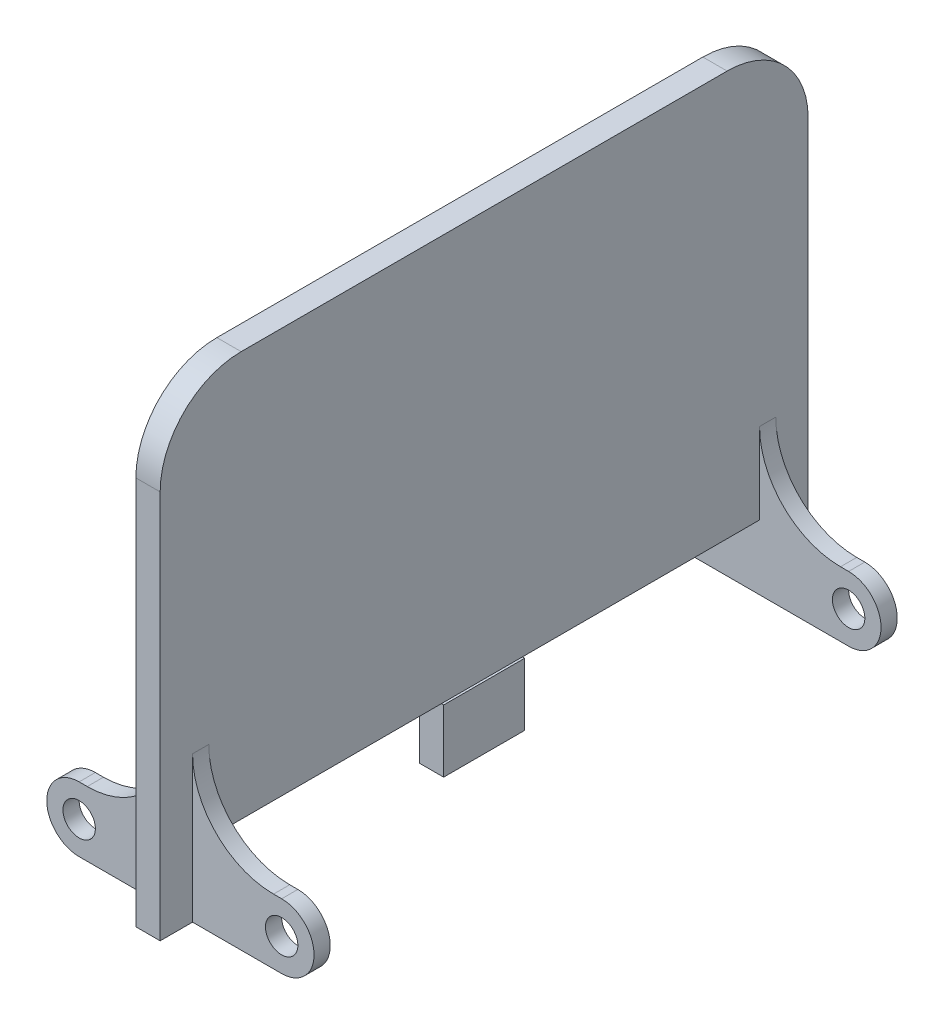
ISO-10303-21;
HEADER;
FILE_DESCRIPTION(('STEP AP214'),'2;1');
FILE_NAME('part.step','',(''),(''),'','','');
FILE_SCHEMA(('AUTOMOTIVE_DESIGN { 1 0 10303 214 1 1 1 1 }'));
ENDSEC;
DATA;
#1=APPLICATION_CONTEXT('core data for automotive mechanical design processes');
#2=APPLICATION_PROTOCOL_DEFINITION('international standard','automotive_design',2000,#1);
#3=PRODUCT_CONTEXT('',#1,'mechanical');
#4=PRODUCT('Part','Part','',(#3));
#5=PRODUCT_RELATED_PRODUCT_CATEGORY('part','',(#4));
#6=PRODUCT_DEFINITION_FORMATION('','',#4);
#7=PRODUCT_DEFINITION_CONTEXT('part definition',#1,'design');
#8=PRODUCT_DEFINITION('design','',#6,#7);
#9=PRODUCT_DEFINITION_SHAPE('','',#8);
#10=(LENGTH_UNIT() NAMED_UNIT(*) SI_UNIT(.MILLI.,.METRE.));
#11=(NAMED_UNIT(*) PLANE_ANGLE_UNIT() SI_UNIT($,.RADIAN.));
#12=(NAMED_UNIT(*) SI_UNIT($,.STERADIAN.) SOLID_ANGLE_UNIT());
#13=UNCERTAINTY_MEASURE_WITH_UNIT(LENGTH_MEASURE(1.E-05),#10,'distance_accuracy_value','');
#14=(GEOMETRIC_REPRESENTATION_CONTEXT(3) GLOBAL_UNCERTAINTY_ASSIGNED_CONTEXT((#13)) GLOBAL_UNIT_ASSIGNED_CONTEXT((#10,
#11,#12)) REPRESENTATION_CONTEXT('',''));
#15=CARTESIAN_POINT('',(0.,0.,0.));
#16=DIRECTION('',(0.,0.,1.));
#17=DIRECTION('',(1.,0.,0.));
#18=AXIS2_PLACEMENT_3D('',#15,#16,#17);
#19=CARTESIAN_POINT('',(-1.63322603296561,3.72,41.));
#20=DIRECTION('',(0.,0.,1.));
#21=DIRECTION('',(1.,0.,0.));
#22=AXIS2_PLACEMENT_3D('',#19,#20,#21);
#23=PLANE('',#22);
#24=DIRECTION('',(0.,1.,0.));
#25=VECTOR('',#24,1.);
#26=CARTESIAN_POINT('',(11.,3.72,41.));
#27=LINE('',#26,#25);
#28=CARTESIAN_POINT('',(11.,-4.,41.));
#29=VERTEX_POINT('',#28);
#30=CARTESIAN_POINT('',(11.,3.72,41.));
#31=VERTEX_POINT('',#30);
#32=EDGE_CURVE('E57',#29,#31,#27,.T.);
#33=ORIENTED_EDGE('',*,*,#32,.F.);
#34=DIRECTION('',(1.,0.,0.));
#35=VECTOR('',#34,1.);
#36=CARTESIAN_POINT('',(-1.63322603296561,-4.,41.));
#37=LINE('',#36,#35);
#38=CARTESIAN_POINT('',(14.,-4.,41.));
#39=VERTEX_POINT('',#38);
#40=EDGE_CURVE('E85',#29,#39,#37,.T.);
#41=ORIENTED_EDGE('',*,*,#40,.T.);
#42=DIRECTION('',(0.,-1.,0.));
#43=VECTOR('',#42,1.);
#44=CARTESIAN_POINT('',(14.,3.72,41.));
#45=LINE('',#44,#43);
#46=CARTESIAN_POINT('',(14.,3.72,41.));
#47=VERTEX_POINT('',#46);
#48=EDGE_CURVE('E89',#47,#39,#45,.T.);
#49=ORIENTED_EDGE('',*,*,#48,.F.);
#50=DIRECTION('',(1.,0.,0.));
#51=VECTOR('',#50,1.);
#52=CARTESIAN_POINT('',(-1.63322603296561,3.72,41.));
#53=LINE('',#52,#51);
#54=EDGE_CURVE('E112',#31,#47,#53,.T.);
#55=ORIENTED_EDGE('',*,*,#54,.F.);
#56=EDGE_LOOP('',(#33,#41,#49,#55));
#57=FACE_BOUND('',#56,.T.);
#58=ADVANCED_FACE('F49',(#57),#23,.T.);
#59=CARTESIAN_POINT('',(-1.63322603296561,3.72,41.));
#60=DIRECTION('',(0.,1.,0.));
#61=DIRECTION('',(-1.,0.,0.));
#62=AXIS2_PLACEMENT_3D('',#59,#60,#61);
#63=PLANE('',#62);
#64=DIRECTION('',(0.,0.,-1.));
#65=VECTOR('',#64,1.);
#66=CARTESIAN_POINT('',(11.,3.72,41.));
#67=LINE('',#66,#65);
#68=CARTESIAN_POINT('',(11.,3.72,31.));
#69=VERTEX_POINT('',#68);
#70=EDGE_CURVE('E63',#31,#69,#67,.T.);
#71=ORIENTED_EDGE('',*,*,#70,.F.);
#72=ORIENTED_EDGE('',*,*,#54,.T.);
#73=DIRECTION('',(0.,0.,1.));
#74=VECTOR('',#73,1.);
#75=CARTESIAN_POINT('',(14.,3.72,41.));
#76=LINE('',#75,#74);
#77=CARTESIAN_POINT('',(14.,3.72,31.));
#78=VERTEX_POINT('',#77);
#79=EDGE_CURVE('E94',#78,#47,#76,.T.);
#80=ORIENTED_EDGE('',*,*,#79,.F.);
#81=DIRECTION('',(1.,0.,0.));
#82=VECTOR('',#81,1.);
#83=CARTESIAN_POINT('',(-1.63322603296561,3.72,31.));
#84=LINE('',#83,#82);
#85=EDGE_CURVE('E115',#69,#78,#84,.T.);
#86=ORIENTED_EDGE('',*,*,#85,.F.);
#87=EDGE_LOOP('',(#71,#72,#80,#86));
#88=FACE_BOUND('',#87,.T.);
#89=ADVANCED_FACE('F121',(#88),#63,.T.);
#90=CARTESIAN_POINT('',(-1.63322603296561,3.72,31.));
#91=DIRECTION('',(0.,0.,-1.));
#92=DIRECTION('',(-1.,0.,0.));
#93=AXIS2_PLACEMENT_3D('',#90,#91,#92);
#94=PLANE('',#93);
#95=DIRECTION('',(0.,-1.,0.));
#96=VECTOR('',#95,1.);
#97=CARTESIAN_POINT('',(11.,3.72,31.));
#98=LINE('',#97,#96);
#99=CARTESIAN_POINT('',(11.,-4.,31.));
#100=VERTEX_POINT('',#99);
#101=EDGE_CURVE('E114',#69,#100,#98,.T.);
#102=ORIENTED_EDGE('',*,*,#101,.F.);
#103=ORIENTED_EDGE('',*,*,#85,.T.);
#104=DIRECTION('',(0.,1.,0.));
#105=VECTOR('',#104,1.);
#106=CARTESIAN_POINT('',(14.,3.72,31.));
#107=LINE('',#106,#105);
#108=CARTESIAN_POINT('',(14.,-4.,31.));
#109=VERTEX_POINT('',#108);
#110=EDGE_CURVE('E102',#109,#78,#107,.T.);
#111=ORIENTED_EDGE('',*,*,#110,.F.);
#112=DIRECTION('',(1.,0.,0.));
#113=VECTOR('',#112,1.);
#114=CARTESIAN_POINT('',(-1.63322603296561,-4.,31.));
#115=LINE('',#114,#113);
#116=EDGE_CURVE('E93',#100,#109,#115,.T.);
#117=ORIENTED_EDGE('',*,*,#116,.F.);
#118=EDGE_LOOP('',(#102,#103,#111,#117));
#119=FACE_BOUND('',#118,.T.);
#120=ADVANCED_FACE('F119',(#119),#94,.T.);
#121=CARTESIAN_POINT('',(-1.63322603296561,-4.,41.));
#122=DIRECTION('',(0.,-1.,0.));
#123=DIRECTION('',(1.,0.,0.));
#124=AXIS2_PLACEMENT_3D('',#121,#122,#123);
#125=PLANE('',#124);
#126=DIRECTION('',(0.,0.,1.));
#127=VECTOR('',#126,1.);
#128=CARTESIAN_POINT('',(11.,-4.,41.));
#129=LINE('',#128,#127);
#130=EDGE_CURVE('E12',#100,#29,#129,.T.);
#131=ORIENTED_EDGE('',*,*,#130,.F.);
#132=ORIENTED_EDGE('',*,*,#116,.T.);
#133=DIRECTION('',(0.,0.,-1.));
#134=VECTOR('',#133,1.);
#135=CARTESIAN_POINT('',(14.,-4.,41.));
#136=LINE('',#135,#134);
#137=EDGE_CURVE('E96',#39,#109,#136,.T.);
#138=ORIENTED_EDGE('',*,*,#137,.F.);
#139=ORIENTED_EDGE('',*,*,#40,.F.);
#140=EDGE_LOOP('',(#131,#132,#138,#139));
#141=FACE_BOUND('',#140,.T.);
#142=ADVANCED_FACE('F97',(#141),#125,.T.);
#143=CARTESIAN_POINT('',(14.,0.,0.));
#144=DIRECTION('',(1.,0.,0.));
#145=DIRECTION('',(0.,0.,-1.));
#146=AXIS2_PLACEMENT_3D('',#143,#144,#145);
#147=PLANE('',#146);
#148=ORIENTED_EDGE('',*,*,#48,.T.);
#149=ORIENTED_EDGE('',*,*,#137,.T.);
#150=ORIENTED_EDGE('',*,*,#110,.T.);
#151=ORIENTED_EDGE('',*,*,#79,.T.);
#152=EDGE_LOOP('',(#148,#149,#150,#151));
#153=FACE_BOUND('',#152,.T.);
#154=ADVANCED_FACE('F104',(#153),#147,.T.);
#155=CARTESIAN_POINT('',(11.,54.,-4.));
#156=DIRECTION('',(1.,0.,0.));
#157=DIRECTION('',(0.,1.,0.));
#158=AXIS2_PLACEMENT_3D('',#155,#156,#157);
#159=PLANE('',#158);
#160=ORIENTED_EDGE('',*,*,#32,.T.);
#161=ORIENTED_EDGE('',*,*,#70,.T.);
#162=ORIENTED_EDGE('',*,*,#101,.T.);
#163=ORIENTED_EDGE('',*,*,#130,.T.);
#164=EDGE_LOOP('',(#160,#161,#162,#163));
#165=FACE_BOUND('',#164,.T.);
#166=ADVANCED_FACE('F123',(#165),#159,.F.);
#167=CLOSED_SHELL('',(#58,#89,#120,#142,#154,#166));
#168=MANIFOLD_SOLID_BREP('B2',#167);
#169=CARTESIAN_POINT('',(0.,0.,72.));
#170=DIRECTION('',(0.,0.,-1.));
#171=DIRECTION('',(1.,0.,0.));
#172=AXIS2_PLACEMENT_3D('',#169,#170,#171);
#173=PLANE('',#172);
#174=CARTESIAN_POINT('',(0.,0.,72.));
#175=DIRECTION('',(0.,0.,1.));
#176=DIRECTION('',(1.,0.,0.));
#177=AXIS2_PLACEMENT_3D('',#174,#175,#176);
#178=CIRCLE('',#177,2.);
#179=CARTESIAN_POINT('',(2.,0.,72.));
#180=VERTEX_POINT('',#179);
#181=EDGE_CURVE('E381',#180,#180,#178,.T.);
#182=ORIENTED_EDGE('',*,*,#181,.F.);
#183=EDGE_LOOP('',(#182));
#184=FACE_BOUND('',#183,.T.);
#185=DIRECTION('',(1.,0.,0.));
#186=VECTOR('',#185,1.);
#187=CARTESIAN_POINT('',(0.,-4.,72.));
#188=LINE('',#187,#186);
#189=CARTESIAN_POINT('',(0.,-4.,72.));
#190=VERTEX_POINT('',#189);
#191=CARTESIAN_POINT('',(11.,-4.,72.));
#192=VERTEX_POINT('',#191);
#193=EDGE_CURVE('E393',#190,#192,#188,.T.);
#194=ORIENTED_EDGE('',*,*,#193,.T.);
#195=DIRECTION('',(0.,1.,0.));
#196=VECTOR('',#195,1.);
#197=CARTESIAN_POINT('',(11.,-9.00000000000001,72.));
#198=LINE('',#197,#196);
#199=CARTESIAN_POINT('',(11.,14.,72.));
#200=VERTEX_POINT('',#199);
#201=EDGE_CURVE('E367',#192,#200,#198,.T.);
#202=ORIENTED_EDGE('',*,*,#201,.T.);
#203=CARTESIAN_POINT('',(0.999999999999994,14.,72.));
#204=DIRECTION('',(0.,0.,-1.));
#205=DIRECTION('',(-1.,0.,0.));
#206=AXIS2_PLACEMENT_3D('',#203,#204,#205);
#207=CIRCLE('',#206,10.);
#208=CARTESIAN_POINT('',(0.999999999999994,4.,72.));
#209=VERTEX_POINT('',#208);
#210=EDGE_CURVE('E540',#200,#209,#207,.T.);
#211=ORIENTED_EDGE('',*,*,#210,.T.);
#212=DIRECTION('',(-1.,0.,0.));
#213=VECTOR('',#212,1.);
#214=CARTESIAN_POINT('',(0.,4.,72.));
#215=LINE('',#214,#213);
#216=CARTESIAN_POINT('',(0.,4.,72.));
#217=VERTEX_POINT('',#216);
#218=EDGE_CURVE('E406',#209,#217,#215,.T.);
#219=ORIENTED_EDGE('',*,*,#218,.T.);
#220=CARTESIAN_POINT('',(0.,0.,72.));
#221=DIRECTION('',(0.,0.,1.));
#222=DIRECTION('',(1.,0.,0.));
#223=AXIS2_PLACEMENT_3D('',#220,#221,#222);
#224=CIRCLE('',#223,4.);
#225=EDGE_CURVE('E386',#217,#190,#224,.T.);
#226=ORIENTED_EDGE('',*,*,#225,.T.);
#227=EDGE_LOOP('',(#194,#202,#211,#219,#226));
#228=FACE_BOUND('',#227,.T.);
#229=ADVANCED_FACE('F173',(#184,#228),#173,.F.);
#230=CARTESIAN_POINT('',(0.,0.,0.));
#231=DIRECTION('',(0.,0.,1.));
#232=DIRECTION('',(1.,0.,0.));
#233=AXIS2_PLACEMENT_3D('',#230,#231,#232);
#234=PLANE('',#233);
#235=CARTESIAN_POINT('',(25.,0.,0.));
#236=DIRECTION('',(0.,0.,1.));
#237=DIRECTION('',(1.,0.,0.));
#238=AXIS2_PLACEMENT_3D('',#235,#236,#237);
#239=CIRCLE('',#238,2.);
#240=CARTESIAN_POINT('',(27.,0.,0.));
#241=VERTEX_POINT('',#240);
#242=EDGE_CURVE('E449',#241,#241,#239,.T.);
#243=ORIENTED_EDGE('',*,*,#242,.T.);
#244=EDGE_LOOP('',(#243));
#245=FACE_BOUND('',#244,.T.);
#246=DIRECTION('',(0.,1.,0.));
#247=VECTOR('',#246,1.);
#248=CARTESIAN_POINT('',(14.,-9.,0.));
#249=LINE('',#248,#247);
#250=CARTESIAN_POINT('',(14.,-4.,0.));
#251=VERTEX_POINT('',#250);
#252=CARTESIAN_POINT('',(14.,14.,0.));
#253=VERTEX_POINT('',#252);
#254=EDGE_CURVE('E427',#251,#253,#249,.T.);
#255=ORIENTED_EDGE('',*,*,#254,.T.);
#256=CARTESIAN_POINT('',(24.,14.,0.));
#257=DIRECTION('',(0.,0.,1.));
#258=DIRECTION('',(1.,0.,0.));
#259=AXIS2_PLACEMENT_3D('',#256,#257,#258);
#260=CIRCLE('',#259,10.);
#261=CARTESIAN_POINT('',(24.,4.,0.));
#262=VERTEX_POINT('',#261);
#263=EDGE_CURVE('E518',#253,#262,#260,.T.);
#264=ORIENTED_EDGE('',*,*,#263,.T.);
#265=DIRECTION('',(-1.,0.,0.));
#266=VECTOR('',#265,1.);
#267=CARTESIAN_POINT('',(0.,4.,0.));
#268=LINE('',#267,#266);
#269=CARTESIAN_POINT('',(25.,4.,0.));
#270=VERTEX_POINT('',#269);
#271=EDGE_CURVE('E466',#270,#262,#268,.T.);
#272=ORIENTED_EDGE('',*,*,#271,.F.);
#273=CARTESIAN_POINT('',(25.,0.,0.));
#274=DIRECTION('',(0.,0.,1.));
#275=DIRECTION('',(1.,0.,0.));
#276=AXIS2_PLACEMENT_3D('',#273,#274,#275);
#277=CIRCLE('',#276,4.);
#278=CARTESIAN_POINT('',(25.,-4.,0.));
#279=VERTEX_POINT('',#278);
#280=EDGE_CURVE('E482',#279,#270,#277,.T.);
#281=ORIENTED_EDGE('',*,*,#280,.F.);
#282=DIRECTION('',(1.,0.,0.));
#283=VECTOR('',#282,1.);
#284=CARTESIAN_POINT('',(0.,-4.,0.));
#285=LINE('',#284,#283);
#286=EDGE_CURVE('E478',#251,#279,#285,.T.);
#287=ORIENTED_EDGE('',*,*,#286,.F.);
#288=EDGE_LOOP('',(#255,#264,#272,#281,#287));
#289=FACE_BOUND('',#288,.T.);
#290=ADVANCED_FACE('F580',(#245,#289),#234,.F.);
#291=CARTESIAN_POINT('',(0.,0.,0.));
#292=DIRECTION('',(0.,0.,1.));
#293=DIRECTION('',(1.,0.,0.));
#294=AXIS2_PLACEMENT_3D('',#291,#292,#293);
#295=CIRCLE('',#294,2.);
#296=CARTESIAN_POINT('',(2.,0.,0.));
#297=VERTEX_POINT('',#296);
#298=EDGE_CURVE('E453',#297,#297,#295,.T.);
#299=ORIENTED_EDGE('',*,*,#298,.T.);
#300=EDGE_LOOP('',(#299));
#301=FACE_BOUND('',#300,.T.);
#302=DIRECTION('',(0.,1.,0.));
#303=VECTOR('',#302,1.);
#304=CARTESIAN_POINT('',(11.,-9.,0.));
#305=LINE('',#304,#303);
#306=CARTESIAN_POINT('',(11.,-4.,0.));
#307=VERTEX_POINT('',#306);
#308=CARTESIAN_POINT('',(11.,14.,0.));
#309=VERTEX_POINT('',#308);
#310=EDGE_CURVE('E422',#307,#309,#305,.T.);
#311=ORIENTED_EDGE('',*,*,#310,.F.);
#312=CARTESIAN_POINT('',(0.,-4.,0.));
#313=VERTEX_POINT('',#312);
#314=EDGE_CURVE('E479',#313,#307,#285,.T.);
#315=ORIENTED_EDGE('',*,*,#314,.F.);
#316=CARTESIAN_POINT('',(0.,0.,0.));
#317=DIRECTION('',(0.,0.,1.));
#318=DIRECTION('',(1.,0.,0.));
#319=AXIS2_PLACEMENT_3D('',#316,#317,#318);
#320=CIRCLE('',#319,4.);
#321=CARTESIAN_POINT('',(0.,4.,0.));
#322=VERTEX_POINT('',#321);
#323=EDGE_CURVE('E459',#322,#313,#320,.T.);
#324=ORIENTED_EDGE('',*,*,#323,.F.);
#325=CARTESIAN_POINT('',(1.,4.,0.));
#326=VERTEX_POINT('',#325);
#327=EDGE_CURVE('E484',#326,#322,#268,.T.);
#328=ORIENTED_EDGE('',*,*,#327,.F.);
#329=CARTESIAN_POINT('',(1.,14.,0.));
#330=DIRECTION('',(0.,0.,1.));
#331=DIRECTION('',(1.,0.,0.));
#332=AXIS2_PLACEMENT_3D('',#329,#330,#331);
#333=CIRCLE('',#332,10.);
#334=EDGE_CURVE('E515',#326,#309,#333,.T.);
#335=ORIENTED_EDGE('',*,*,#334,.T.);
#336=EDGE_LOOP('',(#311,#315,#324,#328,#335));
#337=FACE_BOUND('',#336,.T.);
#338=ADVANCED_FACE('F601',(#301,#337),#234,.F.);
#339=CARTESIAN_POINT('',(0.,4.,2.));
#340=DIRECTION('',(0.,-1.,0.));
#341=DIRECTION('',(0.,0.,-1.));
#342=AXIS2_PLACEMENT_3D('',#339,#340,#341);
#343=PLANE('',#342);
#344=DIRECTION('',(-1.,0.,0.));
#345=VECTOR('',#344,1.);
#346=CARTESIAN_POINT('',(0.,4.,2.));
#347=LINE('',#346,#345);
#348=CARTESIAN_POINT('',(1.,4.,2.));
#349=VERTEX_POINT('',#348);
#350=CARTESIAN_POINT('',(0.,4.,2.));
#351=VERTEX_POINT('',#350);
#352=EDGE_CURVE('E470',#349,#351,#347,.T.);
#353=ORIENTED_EDGE('',*,*,#352,.F.);
#354=DIRECTION('',(0.,0.,1.));
#355=VECTOR('',#354,1.);
#356=CARTESIAN_POINT('',(1.,4.,0.));
#357=LINE('',#356,#355);
#358=EDGE_CURVE('E503',#349,#326,#357,.F.);
#359=ORIENTED_EDGE('',*,*,#358,.T.);
#360=ORIENTED_EDGE('',*,*,#327,.T.);
#361=DIRECTION('',(0.,0.,-1.));
#362=VECTOR('',#361,1.);
#363=CARTESIAN_POINT('',(0.,4.,2.));
#364=LINE('',#363,#362);
#365=EDGE_CURVE('E474',#351,#322,#364,.T.);
#366=ORIENTED_EDGE('',*,*,#365,.F.);
#367=EDGE_LOOP('',(#353,#359,#360,#366));
#368=FACE_BOUND('',#367,.T.);
#369=ADVANCED_FACE('F653',(#368),#343,.F.);
#370=ORIENTED_EDGE('',*,*,#271,.T.);
#371=DIRECTION('',(0.,0.,-1.));
#372=VECTOR('',#371,1.);
#373=CARTESIAN_POINT('',(24.,4.,2.));
#374=LINE('',#373,#372);
#375=CARTESIAN_POINT('',(24.,4.,2.));
#376=VERTEX_POINT('',#375);
#377=EDGE_CURVE('E511',#262,#376,#374,.F.);
#378=ORIENTED_EDGE('',*,*,#377,.T.);
#379=CARTESIAN_POINT('',(25.,4.,2.));
#380=VERTEX_POINT('',#379);
#381=EDGE_CURVE('E471',#380,#376,#347,.T.);
#382=ORIENTED_EDGE('',*,*,#381,.F.);
#383=DIRECTION('',(0.,0.,-1.));
#384=VECTOR('',#383,1.);
#385=CARTESIAN_POINT('',(25.,4.,2.));
#386=LINE('',#385,#384);
#387=EDGE_CURVE('E489',#380,#270,#386,.T.);
#388=ORIENTED_EDGE('',*,*,#387,.T.);
#389=EDGE_LOOP('',(#370,#378,#382,#388));
#390=FACE_BOUND('',#389,.T.);
#391=ADVANCED_FACE('F651',(#390),#343,.F.);
#392=CARTESIAN_POINT('',(0.,0.,2.));
#393=DIRECTION('',(0.,0.,1.));
#394=DIRECTION('',(1.,0.,0.));
#395=AXIS2_PLACEMENT_3D('',#392,#393,#394);
#396=PLANE('',#395);
#397=CARTESIAN_POINT('',(0.,0.,2.));
#398=DIRECTION('',(0.,0.,1.));
#399=DIRECTION('',(1.,0.,0.));
#400=AXIS2_PLACEMENT_3D('',#397,#398,#399);
#401=CIRCLE('',#400,2.);
#402=CARTESIAN_POINT('',(2.,0.,2.));
#403=VERTEX_POINT('',#402);
#404=EDGE_CURVE('E456',#403,#403,#401,.T.);
#405=ORIENTED_EDGE('',*,*,#404,.F.);
#406=EDGE_LOOP('',(#405));
#407=FACE_BOUND('',#406,.T.);
#408=CARTESIAN_POINT('',(0.,0.,2.));
#409=DIRECTION('',(0.,0.,1.));
#410=DIRECTION('',(1.,0.,0.));
#411=AXIS2_PLACEMENT_3D('',#408,#409,#410);
#412=CIRCLE('',#411,4.);
#413=CARTESIAN_POINT('',(0.,-4.,2.));
#414=VERTEX_POINT('',#413);
#415=EDGE_CURVE('E462',#351,#414,#412,.T.);
#416=ORIENTED_EDGE('',*,*,#415,.T.);
#417=DIRECTION('',(1.,0.,0.));
#418=VECTOR('',#417,1.);
#419=CARTESIAN_POINT('',(0.,-4.,2.));
#420=LINE('',#419,#418);
#421=CARTESIAN_POINT('',(25.,-4.,2.));
#422=VERTEX_POINT('',#421);
#423=EDGE_CURVE('E465',#414,#422,#420,.T.);
#424=ORIENTED_EDGE('',*,*,#423,.T.);
#425=CARTESIAN_POINT('',(25.,0.,2.));
#426=DIRECTION('',(0.,0.,1.));
#427=DIRECTION('',(1.,0.,0.));
#428=AXIS2_PLACEMENT_3D('',#425,#426,#427);
#429=CIRCLE('',#428,4.);
#430=EDGE_CURVE('E468',#422,#380,#429,.T.);
#431=ORIENTED_EDGE('',*,*,#430,.T.);
#432=ORIENTED_EDGE('',*,*,#381,.T.);
#433=CARTESIAN_POINT('',(24.,14.,2.));
#434=DIRECTION('',(0.,0.,1.));
#435=DIRECTION('',(1.,0.,0.));
#436=AXIS2_PLACEMENT_3D('',#433,#434,#435);
#437=CIRCLE('',#436,10.);
#438=CARTESIAN_POINT('',(14.,14.,2.));
#439=VERTEX_POINT('',#438);
#440=EDGE_CURVE('E520',#376,#439,#437,.F.);
#441=ORIENTED_EDGE('',*,*,#440,.T.);
#442=DIRECTION('',(0.,1.,0.));
#443=VECTOR('',#442,1.);
#444=CARTESIAN_POINT('',(14.,54.,2.));
#445=LINE('',#444,#443);
#446=CARTESIAN_POINT('',(14.,4.,2.));
#447=VERTEX_POINT('',#446);
#448=EDGE_CURVE('E505',#447,#439,#445,.T.);
#449=ORIENTED_EDGE('',*,*,#448,.F.);
#450=CARTESIAN_POINT('',(11.,4.,2.));
#451=VERTEX_POINT('',#450);
#452=EDGE_CURVE('E475',#447,#451,#347,.T.);
#453=ORIENTED_EDGE('',*,*,#452,.T.);
#454=DIRECTION('',(0.,-1.,0.));
#455=VECTOR('',#454,1.);
#456=CARTESIAN_POINT('',(11.,54.,2.));
#457=LINE('',#456,#455);
#458=CARTESIAN_POINT('',(11.,14.,2.));
#459=VERTEX_POINT('',#458);
#460=EDGE_CURVE('E501',#459,#451,#457,.T.);
#461=ORIENTED_EDGE('',*,*,#460,.F.);
#462=CARTESIAN_POINT('',(1.,14.,2.));
#463=DIRECTION('',(0.,0.,1.));
#464=DIRECTION('',(1.,0.,0.));
#465=AXIS2_PLACEMENT_3D('',#462,#463,#464);
#466=CIRCLE('',#465,10.);
#467=EDGE_CURVE('E513',#459,#349,#466,.F.);
#468=ORIENTED_EDGE('',*,*,#467,.T.);
#469=ORIENTED_EDGE('',*,*,#352,.T.);
#470=EDGE_LOOP('',(#416,#424,#431,#432,#441,#449,#453,#461,#468,#469));
#471=FACE_BOUND('',#470,.T.);
#472=CARTESIAN_POINT('',(25.,0.,2.));
#473=DIRECTION('',(0.,0.,1.));
#474=DIRECTION('',(1.,0.,0.));
#475=AXIS2_PLACEMENT_3D('',#472,#473,#474);
#476=CIRCLE('',#475,2.);
#477=CARTESIAN_POINT('',(27.,0.,2.));
#478=VERTEX_POINT('',#477);
#479=EDGE_CURVE('E450',#478,#478,#476,.T.);
#480=ORIENTED_EDGE('',*,*,#479,.F.);
#481=EDGE_LOOP('',(#480));
#482=FACE_BOUND('',#481,.T.);
#483=ADVANCED_FACE('F589',(#407,#471,#482),#396,.T.);
#484=CARTESIAN_POINT('',(0.,0.,2.));
#485=DIRECTION('',(0.,0.,-1.));
#486=DIRECTION('',(-1.,0.,0.));
#487=AXIS2_PLACEMENT_3D('',#484,#485,#486);
#488=CYLINDRICAL_SURFACE('',#487,4.);
#489=ORIENTED_EDGE('',*,*,#323,.T.);
#490=DIRECTION('',(0.,0.,-1.));
#491=VECTOR('',#490,1.);
#492=CARTESIAN_POINT('',(0.,-4.,2.));
#493=LINE('',#492,#491);
#494=EDGE_CURVE('E495',#414,#313,#493,.T.);
#495=ORIENTED_EDGE('',*,*,#494,.F.);
#496=ORIENTED_EDGE('',*,*,#415,.F.);
#497=ORIENTED_EDGE('',*,*,#365,.T.);
#498=EDGE_LOOP('',(#489,#495,#496,#497));
#499=FACE_BOUND('',#498,.T.);
#500=ADVANCED_FACE('F596',(#499),#488,.T.);
#501=CARTESIAN_POINT('',(0.,-4.,2.));
#502=DIRECTION('',(0.,1.,0.));
#503=DIRECTION('',(0.,0.,1.));
#504=AXIS2_PLACEMENT_3D('',#501,#502,#503);
#505=PLANE('',#504);
#506=ORIENTED_EDGE('',*,*,#314,.T.);
#507=DIRECTION('',(0.,0.,1.));
#508=VECTOR('',#507,1.);
#509=CARTESIAN_POINT('',(11.,-4.,0.));
#510=LINE('',#509,#508);
#511=CARTESIAN_POINT('',(11.,-4.,-4.));
#512=VERTEX_POINT('',#511);
#513=EDGE_CURVE('E430',#512,#307,#510,.T.);
#514=ORIENTED_EDGE('',*,*,#513,.F.);
#515=DIRECTION('',(-1.,0.,0.));
#516=VECTOR('',#515,1.);
#517=CARTESIAN_POINT('',(11.,-4.,-4.));
#518=LINE('',#517,#516);
#519=CARTESIAN_POINT('',(14.,-4.,-4.));
#520=VERTEX_POINT('',#519);
#521=EDGE_CURVE('E426',#520,#512,#518,.T.);
#522=ORIENTED_EDGE('',*,*,#521,.F.);
#523=DIRECTION('',(0.,0.,-1.));
#524=VECTOR('',#523,1.);
#525=CARTESIAN_POINT('',(14.,-4.,0.));
#526=LINE('',#525,#524);
#527=EDGE_CURVE('E423',#251,#520,#526,.T.);
#528=ORIENTED_EDGE('',*,*,#527,.F.);
#529=ORIENTED_EDGE('',*,*,#286,.T.);
#530=DIRECTION('',(0.,0.,-1.));
#531=VECTOR('',#530,1.);
#532=CARTESIAN_POINT('',(25.,-4.,2.));
#533=LINE('',#532,#531);
#534=EDGE_CURVE('E492',#422,#279,#533,.T.);
#535=ORIENTED_EDGE('',*,*,#534,.F.);
#536=ORIENTED_EDGE('',*,*,#423,.F.);
#537=ORIENTED_EDGE('',*,*,#494,.T.);
#538=EDGE_LOOP('',(#506,#514,#522,#528,#529,#535,#536,#537));
#539=FACE_BOUND('',#538,.T.);
#540=ADVANCED_FACE('F573',(#539),#505,.F.);
#541=CARTESIAN_POINT('',(25.,0.,2.));
#542=DIRECTION('',(0.,0.,-1.));
#543=DIRECTION('',(-1.,0.,0.));
#544=AXIS2_PLACEMENT_3D('',#541,#542,#543);
#545=CYLINDRICAL_SURFACE('',#544,4.);
#546=ORIENTED_EDGE('',*,*,#280,.T.);
#547=ORIENTED_EDGE('',*,*,#387,.F.);
#548=ORIENTED_EDGE('',*,*,#430,.F.);
#549=ORIENTED_EDGE('',*,*,#534,.T.);
#550=EDGE_LOOP('',(#546,#547,#548,#549));
#551=FACE_BOUND('',#550,.T.);
#552=ADVANCED_FACE('F585',(#551),#545,.T.);
#553=CARTESIAN_POINT('',(0.,0.,2.));
#554=DIRECTION('',(0.,0.,-1.));
#555=DIRECTION('',(-1.,0.,0.));
#556=AXIS2_PLACEMENT_3D('',#553,#554,#555);
#557=CYLINDRICAL_SURFACE('',#556,2.);
#558=ORIENTED_EDGE('',*,*,#404,.T.);
#559=EDGE_LOOP('',(#558));
#560=FACE_BOUND('',#559,.T.);
#561=ORIENTED_EDGE('',*,*,#298,.F.);
#562=EDGE_LOOP('',(#561));
#563=FACE_BOUND('',#562,.T.);
#564=ADVANCED_FACE('F903',(#560,#563),#557,.F.);
#565=CARTESIAN_POINT('',(25.,0.,2.));
#566=DIRECTION('',(0.,0.,-1.));
#567=DIRECTION('',(-1.,0.,0.));
#568=AXIS2_PLACEMENT_3D('',#565,#566,#567);
#569=CYLINDRICAL_SURFACE('',#568,2.);
#570=ORIENTED_EDGE('',*,*,#479,.T.);
#571=EDGE_LOOP('',(#570));
#572=FACE_BOUND('',#571,.T.);
#573=ORIENTED_EDGE('',*,*,#242,.F.);
#574=EDGE_LOOP('',(#573));
#575=FACE_BOUND('',#574,.T.);
#576=ADVANCED_FACE('F775',(#572,#575),#569,.F.);
#577=CARTESIAN_POINT('',(11.,54.,-4.));
#578=DIRECTION('',(1.,0.,0.));
#579=DIRECTION('',(0.,1.,0.));
#580=AXIS2_PLACEMENT_3D('',#577,#578,#579);
#581=PLANE('',#580);
#582=DIRECTION('',(0.,0.,1.));
#583=VECTOR('',#582,1.);
#584=CARTESIAN_POINT('',(11.,54.,-4.));
#585=LINE('',#584,#583);
#586=CARTESIAN_POINT('',(11.,54.,6.));
#587=VERTEX_POINT('',#586);
#588=CARTESIAN_POINT('',(11.,54.,66.));
#589=VERTEX_POINT('',#588);
#590=EDGE_CURVE('E435',#587,#589,#585,.T.);
#591=ORIENTED_EDGE('',*,*,#590,.F.);
#592=CARTESIAN_POINT('',(11.,44.,6.));
#593=DIRECTION('',(1.,0.,0.));
#594=DIRECTION('',(0.,1.,0.));
#595=AXIS2_PLACEMENT_3D('',#592,#593,#594);
#596=CIRCLE('',#595,10.);
#597=CARTESIAN_POINT('',(11.,44.,-4.));
#598=VERTEX_POINT('',#597);
#599=EDGE_CURVE('E556',#587,#598,#596,.F.);
#600=ORIENTED_EDGE('',*,*,#599,.T.);
#601=DIRECTION('',(0.,-1.,0.));
#602=VECTOR('',#601,1.);
#603=CARTESIAN_POINT('',(11.,54.,-4.));
#604=LINE('',#603,#602);
#605=EDGE_CURVE('E442',#598,#512,#604,.T.);
#606=ORIENTED_EDGE('',*,*,#605,.T.);
#607=ORIENTED_EDGE('',*,*,#513,.T.);
#608=ORIENTED_EDGE('',*,*,#310,.T.);
#609=DIRECTION('',(0.,0.,1.));
#610=VECTOR('',#609,1.);
#611=CARTESIAN_POINT('',(11.,14.,2.));
#612=LINE('',#611,#610);
#613=EDGE_CURVE('E498',#309,#459,#612,.T.);
#614=ORIENTED_EDGE('',*,*,#613,.T.);
#615=ORIENTED_EDGE('',*,*,#460,.T.);
#616=DIRECTION('',(0.,0.,1.));
#617=VECTOR('',#616,1.);
#618=CARTESIAN_POINT('',(11.,4.,-4.));
#619=LINE('',#618,#617);
#620=CARTESIAN_POINT('',(11.,4.,70.));
#621=VERTEX_POINT('',#620);
#622=EDGE_CURVE('E432',#451,#621,#619,.T.);
#623=ORIENTED_EDGE('',*,*,#622,.T.);
#624=DIRECTION('',(0.,1.,0.));
#625=VECTOR('',#624,1.);
#626=CARTESIAN_POINT('',(11.,54.,70.));
#627=LINE('',#626,#625);
#628=CARTESIAN_POINT('',(11.,14.,70.));
#629=VERTEX_POINT('',#628);
#630=EDGE_CURVE('E525',#621,#629,#627,.T.);
#631=ORIENTED_EDGE('',*,*,#630,.T.);
#632=DIRECTION('',(0.,0.,1.));
#633=VECTOR('',#632,1.);
#634=CARTESIAN_POINT('',(11.,14.,-4.));
#635=LINE('',#634,#633);
#636=EDGE_CURVE('E528',#629,#200,#635,.T.);
#637=ORIENTED_EDGE('',*,*,#636,.T.);
#638=ORIENTED_EDGE('',*,*,#201,.F.);
#639=DIRECTION('',(0.,0.,-1.));
#640=VECTOR('',#639,1.);
#641=CARTESIAN_POINT('',(11.,-4.,72.));
#642=LINE('',#641,#640);
#643=CARTESIAN_POINT('',(11.,-4.,76.));
#644=VERTEX_POINT('',#643);
#645=EDGE_CURVE('E366',#644,#192,#642,.T.);
#646=ORIENTED_EDGE('',*,*,#645,.F.);
#647=DIRECTION('',(0.,-1.,0.));
#648=VECTOR('',#647,1.);
#649=CARTESIAN_POINT('',(11.,54.,76.));
#650=LINE('',#649,#648);
#651=CARTESIAN_POINT('',(11.,44.,76.));
#652=VERTEX_POINT('',#651);
#653=EDGE_CURVE('E353',#652,#644,#650,.T.);
#654=ORIENTED_EDGE('',*,*,#653,.F.);
#655=CARTESIAN_POINT('',(11.,44.,66.));
#656=DIRECTION('',(1.,0.,0.));
#657=DIRECTION('',(0.,1.,0.));
#658=AXIS2_PLACEMENT_3D('',#655,#656,#657);
#659=CIRCLE('',#658,10.);
#660=EDGE_CURVE('E554',#652,#589,#659,.F.);
#661=ORIENTED_EDGE('',*,*,#660,.T.);
#662=EDGE_LOOP('',(#591,#600,#606,#607,#608,#614,#615,#623,#631,#637,#638,#646,#654,#661));
#663=FACE_BOUND('',#662,.T.);
#664=ADVANCED_FACE('F568',(#663),#581,.F.);
#665=CARTESIAN_POINT('',(14.,54.,-4.));
#666=DIRECTION('',(-1.,0.,0.));
#667=DIRECTION('',(0.,-1.,0.));
#668=AXIS2_PLACEMENT_3D('',#665,#666,#667);
#669=PLANE('',#668);
#670=DIRECTION('',(0.,-1.,0.));
#671=VECTOR('',#670,1.);
#672=CARTESIAN_POINT('',(14.,54.,-4.));
#673=LINE('',#672,#671);
#674=CARTESIAN_POINT('',(14.,44.,-4.));
#675=VERTEX_POINT('',#674);
#676=EDGE_CURVE('E447',#675,#520,#673,.T.);
#677=ORIENTED_EDGE('',*,*,#676,.F.);
#678=CARTESIAN_POINT('',(14.,44.,6.));
#679=DIRECTION('',(-1.,0.,0.));
#680=DIRECTION('',(0.,-1.,0.));
#681=AXIS2_PLACEMENT_3D('',#678,#679,#680);
#682=CIRCLE('',#681,10.);
#683=CARTESIAN_POINT('',(14.,54.,6.));
#684=VERTEX_POINT('',#683);
#685=EDGE_CURVE('E181',#675,#684,#682,.F.);
#686=ORIENTED_EDGE('',*,*,#685,.T.);
#687=DIRECTION('',(0.,0.,-1.));
#688=VECTOR('',#687,1.);
#689=CARTESIAN_POINT('',(14.,54.,-4.));
#690=LINE('',#689,#688);
#691=CARTESIAN_POINT('',(14.,54.,66.));
#692=VERTEX_POINT('',#691);
#693=EDGE_CURVE('E438',#692,#684,#690,.T.);
#694=ORIENTED_EDGE('',*,*,#693,.F.);
#695=CARTESIAN_POINT('',(14.,44.,66.));
#696=DIRECTION('',(-1.,0.,0.));
#697=DIRECTION('',(0.,-1.,0.));
#698=AXIS2_PLACEMENT_3D('',#695,#696,#697);
#699=CIRCLE('',#698,10.);
#700=CARTESIAN_POINT('',(14.,44.,76.));
#701=VERTEX_POINT('',#700);
#702=EDGE_CURVE('E188',#692,#701,#699,.F.);
#703=ORIENTED_EDGE('',*,*,#702,.T.);
#704=DIRECTION('',(0.,-1.,0.));
#705=VECTOR('',#704,1.);
#706=CARTESIAN_POINT('',(14.,54.,76.));
#707=LINE('',#706,#705);
#708=CARTESIAN_POINT('',(14.,-4.,76.));
#709=VERTEX_POINT('',#708);
#710=EDGE_CURVE('E346',#701,#709,#707,.T.);
#711=ORIENTED_EDGE('',*,*,#710,.T.);
#712=DIRECTION('',(0.,0.,1.));
#713=VECTOR('',#712,1.);
#714=CARTESIAN_POINT('',(14.,-4.,72.));
#715=LINE('',#714,#713);
#716=CARTESIAN_POINT('',(14.,-4.,72.));
#717=VERTEX_POINT('',#716);
#718=EDGE_CURVE('E349',#717,#709,#715,.T.);
#719=ORIENTED_EDGE('',*,*,#718,.F.);
#720=DIRECTION('',(0.,1.,0.));
#721=VECTOR('',#720,1.);
#722=CARTESIAN_POINT('',(14.,-9.00000000000001,72.));
#723=LINE('',#722,#721);
#724=CARTESIAN_POINT('',(14.,14.,72.));
#725=VERTEX_POINT('',#724);
#726=EDGE_CURVE('E635',#717,#725,#723,.T.);
#727=ORIENTED_EDGE('',*,*,#726,.T.);
#728=DIRECTION('',(0.,0.,-1.));
#729=VECTOR('',#728,1.);
#730=CARTESIAN_POINT('',(14.,14.,-4.));
#731=LINE('',#730,#729);
#732=CARTESIAN_POINT('',(14.,14.,70.));
#733=VERTEX_POINT('',#732);
#734=EDGE_CURVE('E533',#725,#733,#731,.T.);
#735=ORIENTED_EDGE('',*,*,#734,.T.);
#736=DIRECTION('',(0.,-1.,0.));
#737=VECTOR('',#736,1.);
#738=CARTESIAN_POINT('',(14.,54.,70.));
#739=LINE('',#738,#737);
#740=CARTESIAN_POINT('',(14.,4.,70.));
#741=VERTEX_POINT('',#740);
#742=EDGE_CURVE('E536',#733,#741,#739,.T.);
#743=ORIENTED_EDGE('',*,*,#742,.T.);
#744=DIRECTION('',(0.,0.,-1.));
#745=VECTOR('',#744,1.);
#746=CARTESIAN_POINT('',(14.,4.,-4.));
#747=LINE('',#746,#745);
#748=EDGE_CURVE('E439',#741,#447,#747,.T.);
#749=ORIENTED_EDGE('',*,*,#748,.T.);
#750=ORIENTED_EDGE('',*,*,#448,.T.);
#751=DIRECTION('',(0.,0.,-1.));
#752=VECTOR('',#751,1.);
#753=CARTESIAN_POINT('',(14.,14.,0.));
#754=LINE('',#753,#752);
#755=EDGE_CURVE('E508',#439,#253,#754,.T.);
#756=ORIENTED_EDGE('',*,*,#755,.T.);
#757=ORIENTED_EDGE('',*,*,#254,.F.);
#758=ORIENTED_EDGE('',*,*,#527,.T.);
#759=EDGE_LOOP('',(#677,#686,#694,#703,#711,#719,#727,#735,#743,#749,#750,#756,#757,#758));
#760=FACE_BOUND('',#759,.T.);
#761=ADVANCED_FACE('F348',(#760),#669,.F.);
#762=CARTESIAN_POINT('',(11.,54.,-4.));
#763=DIRECTION('',(0.,0.,1.));
#764=DIRECTION('',(1.,0.,0.));
#765=AXIS2_PLACEMENT_3D('',#762,#763,#764);
#766=PLANE('',#765);
#767=ORIENTED_EDGE('',*,*,#605,.F.);
#768=DIRECTION('',(-1.,0.,0.));
#769=VECTOR('',#768,1.);
#770=CARTESIAN_POINT('',(14.,44.,-4.));
#771=LINE('',#770,#769);
#772=EDGE_CURVE('E196',#598,#675,#771,.F.);
#773=ORIENTED_EDGE('',*,*,#772,.T.);
#774=ORIENTED_EDGE('',*,*,#676,.T.);
#775=ORIENTED_EDGE('',*,*,#521,.T.);
#776=EDGE_LOOP('',(#767,#773,#774,#775));
#777=FACE_BOUND('',#776,.T.);
#778=ADVANCED_FACE('F570',(#777),#766,.F.);
#779=CARTESIAN_POINT('',(0.,54.,0.));
#780=DIRECTION('',(0.,1.,0.));
#781=DIRECTION('',(0.,0.,1.));
#782=AXIS2_PLACEMENT_3D('',#779,#780,#781);
#783=PLANE('',#782);
#784=ORIENTED_EDGE('',*,*,#693,.T.);
#785=DIRECTION('',(-1.,0.,0.));
#786=VECTOR('',#785,1.);
#787=CARTESIAN_POINT('',(11.,54.,6.));
#788=LINE('',#787,#786);
#789=EDGE_CURVE('E551',#684,#587,#788,.T.);
#790=ORIENTED_EDGE('',*,*,#789,.T.);
#791=ORIENTED_EDGE('',*,*,#590,.T.);
#792=DIRECTION('',(-1.,0.,0.));
#793=VECTOR('',#792,1.);
#794=CARTESIAN_POINT('',(0.,54.,66.));
#795=LINE('',#794,#793);
#796=EDGE_CURVE('E549',#589,#692,#795,.F.);
#797=ORIENTED_EDGE('',*,*,#796,.T.);
#798=EDGE_LOOP('',(#784,#790,#791,#797));
#799=FACE_BOUND('',#798,.T.);
#800=ADVANCED_FACE('F563',(#799),#783,.T.);
#801=CARTESIAN_POINT('',(0.,4.,0.));
#802=DIRECTION('',(0.,1.,0.));
#803=DIRECTION('',(0.,0.,1.));
#804=AXIS2_PLACEMENT_3D('',#801,#802,#803);
#805=PLANE('',#804);
#806=ORIENTED_EDGE('',*,*,#748,.F.);
#807=DIRECTION('',(-1.,0.,0.));
#808=VECTOR('',#807,1.);
#809=CARTESIAN_POINT('',(0.,4.,70.));
#810=LINE('',#809,#808);
#811=EDGE_CURVE('E522',#741,#621,#810,.T.);
#812=ORIENTED_EDGE('',*,*,#811,.T.);
#813=ORIENTED_EDGE('',*,*,#622,.F.);
#814=ORIENTED_EDGE('',*,*,#452,.F.);
#815=EDGE_LOOP('',(#806,#812,#813,#814));
#816=FACE_BOUND('',#815,.T.);
#817=ADVANCED_FACE('F615',(#816),#805,.F.);
#818=CARTESIAN_POINT('',(1.,14.,-4.));
#819=DIRECTION('',(0.,0.,-1.));
#820=DIRECTION('',(-1.,0.,0.));
#821=AXIS2_PLACEMENT_3D('',#818,#819,#820);
#822=CYLINDRICAL_SURFACE('',#821,10.);
#823=ORIENTED_EDGE('',*,*,#334,.F.);
#824=ORIENTED_EDGE('',*,*,#358,.F.);
#825=ORIENTED_EDGE('',*,*,#467,.F.);
#826=ORIENTED_EDGE('',*,*,#613,.F.);
#827=EDGE_LOOP('',(#823,#824,#825,#826));
#828=FACE_BOUND('',#827,.T.);
#829=ADVANCED_FACE('F607',(#828),#822,.F.);
#830=CARTESIAN_POINT('',(24.,14.,-4.));
#831=DIRECTION('',(0.,0.,1.));
#832=DIRECTION('',(1.,0.,0.));
#833=AXIS2_PLACEMENT_3D('',#830,#831,#832);
#834=CYLINDRICAL_SURFACE('',#833,10.);
#835=ORIENTED_EDGE('',*,*,#440,.F.);
#836=ORIENTED_EDGE('',*,*,#377,.F.);
#837=ORIENTED_EDGE('',*,*,#263,.F.);
#838=ORIENTED_EDGE('',*,*,#755,.F.);
#839=EDGE_LOOP('',(#835,#836,#837,#838));
#840=FACE_BOUND('',#839,.T.);
#841=ADVANCED_FACE('F648',(#840),#834,.F.);
#842=CARTESIAN_POINT('',(11.,54.,76.));
#843=DIRECTION('',(0.,0.,1.));
#844=DIRECTION('',(1.,0.,0.));
#845=AXIS2_PLACEMENT_3D('',#842,#843,#844);
#846=PLANE('',#845);
#847=ORIENTED_EDGE('',*,*,#710,.F.);
#848=DIRECTION('',(-1.,0.,0.));
#849=VECTOR('',#848,1.);
#850=CARTESIAN_POINT('',(11.,44.,76.));
#851=LINE('',#850,#849);
#852=EDGE_CURVE('E47',#701,#652,#851,.T.);
#853=ORIENTED_EDGE('',*,*,#852,.T.);
#854=ORIENTED_EDGE('',*,*,#653,.T.);
#855=DIRECTION('',(-1.,0.,0.));
#856=VECTOR('',#855,1.);
#857=CARTESIAN_POINT('',(11.,-4.,76.));
#858=LINE('',#857,#856);
#859=EDGE_CURVE('E361',#709,#644,#858,.T.);
#860=ORIENTED_EDGE('',*,*,#859,.F.);
#861=EDGE_LOOP('',(#847,#853,#854,#860));
#862=FACE_BOUND('',#861,.T.);
#863=ADVANCED_FACE('F369',(#862),#846,.T.);
#864=CARTESIAN_POINT('',(0.,4.,70.));
#865=DIRECTION('',(0.,1.,0.));
#866=DIRECTION('',(0.,0.,1.));
#867=AXIS2_PLACEMENT_3D('',#864,#865,#866);
#868=PLANE('',#867);
#869=ORIENTED_EDGE('',*,*,#218,.F.);
#870=DIRECTION('',(0.,0.,1.));
#871=VECTOR('',#870,1.);
#872=CARTESIAN_POINT('',(0.999999999999994,4.,70.));
#873=LINE('',#872,#871);
#874=CARTESIAN_POINT('',(0.999999999999994,4.,70.));
#875=VERTEX_POINT('',#874);
#876=EDGE_CURVE('E531',#209,#875,#873,.F.);
#877=ORIENTED_EDGE('',*,*,#876,.T.);
#878=DIRECTION('',(-1.,0.,0.));
#879=VECTOR('',#878,1.);
#880=CARTESIAN_POINT('',(0.,4.,70.));
#881=LINE('',#880,#879);
#882=CARTESIAN_POINT('',(0.,4.,70.));
#883=VERTEX_POINT('',#882);
#884=EDGE_CURVE('E392',#875,#883,#881,.T.);
#885=ORIENTED_EDGE('',*,*,#884,.T.);
#886=DIRECTION('',(0.,0.,1.));
#887=VECTOR('',#886,1.);
#888=CARTESIAN_POINT('',(0.,4.,70.));
#889=LINE('',#888,#887);
#890=EDGE_CURVE('E354',#883,#217,#889,.T.);
#891=ORIENTED_EDGE('',*,*,#890,.T.);
#892=EDGE_LOOP('',(#869,#877,#885,#891));
#893=FACE_BOUND('',#892,.T.);
#894=ADVANCED_FACE('F628',(#893),#868,.T.);
#895=CARTESIAN_POINT('',(25.,4.,70.));
#896=VERTEX_POINT('',#895);
#897=CARTESIAN_POINT('',(24.,4.,70.));
#898=VERTEX_POINT('',#897);
#899=EDGE_CURVE('E394',#896,#898,#881,.T.);
#900=ORIENTED_EDGE('',*,*,#899,.T.);
#901=DIRECTION('',(0.,0.,-1.));
#902=VECTOR('',#901,1.);
#903=CARTESIAN_POINT('',(24.,4.,70.));
#904=LINE('',#903,#902);
#905=CARTESIAN_POINT('',(24.,4.,72.));
#906=VERTEX_POINT('',#905);
#907=EDGE_CURVE('E538',#898,#906,#904,.F.);
#908=ORIENTED_EDGE('',*,*,#907,.T.);
#909=CARTESIAN_POINT('',(25.,4.,72.));
#910=VERTEX_POINT('',#909);
#911=EDGE_CURVE('E407',#910,#906,#215,.T.);
#912=ORIENTED_EDGE('',*,*,#911,.F.);
#913=DIRECTION('',(0.,0.,1.));
#914=VECTOR('',#913,1.);
#915=CARTESIAN_POINT('',(25.,4.,70.));
#916=LINE('',#915,#914);
#917=EDGE_CURVE('E417',#896,#910,#916,.T.);
#918=ORIENTED_EDGE('',*,*,#917,.F.);
#919=EDGE_LOOP('',(#900,#908,#912,#918));
#920=FACE_BOUND('',#919,.T.);
#921=ADVANCED_FACE('F816',(#920),#868,.T.);
#922=CARTESIAN_POINT('',(0.,0.,70.));
#923=DIRECTION('',(0.,0.,1.));
#924=DIRECTION('',(1.,0.,0.));
#925=AXIS2_PLACEMENT_3D('',#922,#923,#924);
#926=CYLINDRICAL_SURFACE('',#925,4.);
#927=ORIENTED_EDGE('',*,*,#225,.F.);
#928=ORIENTED_EDGE('',*,*,#890,.F.);
#929=CARTESIAN_POINT('',(0.,0.,70.));
#930=DIRECTION('',(0.,0.,1.));
#931=DIRECTION('',(1.,0.,0.));
#932=AXIS2_PLACEMENT_3D('',#929,#930,#931);
#933=CIRCLE('',#932,4.);
#934=CARTESIAN_POINT('',(0.,-4.,70.));
#935=VERTEX_POINT('',#934);
#936=EDGE_CURVE('E389',#883,#935,#933,.T.);
#937=ORIENTED_EDGE('',*,*,#936,.T.);
#938=DIRECTION('',(0.,0.,1.));
#939=VECTOR('',#938,1.);
#940=CARTESIAN_POINT('',(0.,-4.,70.));
#941=LINE('',#940,#939);
#942=EDGE_CURVE('E403',#935,#190,#941,.T.);
#943=ORIENTED_EDGE('',*,*,#942,.T.);
#944=EDGE_LOOP('',(#927,#928,#937,#943));
#945=FACE_BOUND('',#944,.T.);
#946=ADVANCED_FACE('F634',(#945),#926,.T.);
#947=CARTESIAN_POINT('',(25.,0.,70.));
#948=DIRECTION('',(0.,0.,1.));
#949=DIRECTION('',(1.,0.,0.));
#950=AXIS2_PLACEMENT_3D('',#947,#948,#949);
#951=CYLINDRICAL_SURFACE('',#950,4.);
#952=CARTESIAN_POINT('',(25.,0.,72.));
#953=DIRECTION('',(0.,0.,1.));
#954=DIRECTION('',(1.,0.,0.));
#955=AXIS2_PLACEMENT_3D('',#952,#953,#954);
#956=CIRCLE('',#955,4.);
#957=CARTESIAN_POINT('',(25.,-4.,72.));
#958=VERTEX_POINT('',#957);
#959=EDGE_CURVE('E410',#958,#910,#956,.T.);
#960=ORIENTED_EDGE('',*,*,#959,.F.);
#961=DIRECTION('',(0.,0.,1.));
#962=VECTOR('',#961,1.);
#963=CARTESIAN_POINT('',(25.,-4.,70.));
#964=LINE('',#963,#962);
#965=CARTESIAN_POINT('',(25.,-4.,70.));
#966=VERTEX_POINT('',#965);
#967=EDGE_CURVE('E415',#966,#958,#964,.T.);
#968=ORIENTED_EDGE('',*,*,#967,.F.);
#969=CARTESIAN_POINT('',(25.,0.,70.));
#970=DIRECTION('',(0.,0.,1.));
#971=DIRECTION('',(1.,0.,0.));
#972=AXIS2_PLACEMENT_3D('',#969,#970,#971);
#973=CIRCLE('',#972,4.);
#974=EDGE_CURVE('E397',#966,#896,#973,.T.);
#975=ORIENTED_EDGE('',*,*,#974,.T.);
#976=ORIENTED_EDGE('',*,*,#917,.T.);
#977=EDGE_LOOP('',(#960,#968,#975,#976));
#978=FACE_BOUND('',#977,.T.);
#979=ADVANCED_FACE('F739',(#978),#951,.T.);
#980=CARTESIAN_POINT('',(0.,-4.,70.));
#981=DIRECTION('',(0.,-1.,0.));
#982=DIRECTION('',(0.,0.,-1.));
#983=AXIS2_PLACEMENT_3D('',#980,#981,#982);
#984=PLANE('',#983);
#985=ORIENTED_EDGE('',*,*,#193,.F.);
#986=ORIENTED_EDGE('',*,*,#942,.F.);
#987=DIRECTION('',(1.,0.,0.));
#988=VECTOR('',#987,1.);
#989=CARTESIAN_POINT('',(0.,-4.,70.));
#990=LINE('',#989,#988);
#991=EDGE_CURVE('E400',#935,#966,#990,.T.);
#992=ORIENTED_EDGE('',*,*,#991,.T.);
#993=ORIENTED_EDGE('',*,*,#967,.T.);
#994=EDGE_CURVE('E364',#717,#958,#188,.T.);
#995=ORIENTED_EDGE('',*,*,#994,.F.);
#996=ORIENTED_EDGE('',*,*,#718,.T.);
#997=ORIENTED_EDGE('',*,*,#859,.T.);
#998=ORIENTED_EDGE('',*,*,#645,.T.);
#999=EDGE_LOOP('',(#985,#986,#992,#993,#995,#996,#997,#998));
#1000=FACE_BOUND('',#999,.T.);
#1001=ADVANCED_FACE('F359',(#1000),#984,.T.);
#1002=CARTESIAN_POINT('',(0.,0.,70.));
#1003=DIRECTION('',(0.,0.,-1.));
#1004=DIRECTION('',(1.,0.,0.));
#1005=AXIS2_PLACEMENT_3D('',#1002,#1003,#1004);
#1006=PLANE('',#1005);
#1007=CARTESIAN_POINT('',(25.,0.,70.));
#1008=DIRECTION('',(0.,0.,1.));
#1009=DIRECTION('',(1.,0.,0.));
#1010=AXIS2_PLACEMENT_3D('',#1007,#1008,#1009);
#1011=CIRCLE('',#1010,2.);
#1012=CARTESIAN_POINT('',(27.,0.,70.));
#1013=VERTEX_POINT('',#1012);
#1014=EDGE_CURVE('E374',#1013,#1013,#1011,.T.);
#1015=ORIENTED_EDGE('',*,*,#1014,.T.);
#1016=EDGE_LOOP('',(#1015));
#1017=FACE_BOUND('',#1016,.T.);
#1018=CARTESIAN_POINT('',(0.,0.,70.));
#1019=DIRECTION('',(0.,0.,1.));
#1020=DIRECTION('',(1.,0.,0.));
#1021=AXIS2_PLACEMENT_3D('',#1018,#1019,#1020);
#1022=CIRCLE('',#1021,2.);
#1023=CARTESIAN_POINT('',(2.,0.,70.));
#1024=VERTEX_POINT('',#1023);
#1025=EDGE_CURVE('E383',#1024,#1024,#1022,.T.);
#1026=ORIENTED_EDGE('',*,*,#1025,.T.);
#1027=EDGE_LOOP('',(#1026));
#1028=FACE_BOUND('',#1027,.T.);
#1029=ORIENTED_EDGE('',*,*,#936,.F.);
#1030=ORIENTED_EDGE('',*,*,#884,.F.);
#1031=CARTESIAN_POINT('',(0.999999999999994,14.,70.));
#1032=DIRECTION('',(0.,0.,-1.));
#1033=DIRECTION('',(-1.,0.,0.));
#1034=AXIS2_PLACEMENT_3D('',#1031,#1032,#1033);
#1035=CIRCLE('',#1034,10.);
#1036=EDGE_CURVE('E542',#875,#629,#1035,.F.);
#1037=ORIENTED_EDGE('',*,*,#1036,.T.);
#1038=ORIENTED_EDGE('',*,*,#630,.F.);
#1039=ORIENTED_EDGE('',*,*,#811,.F.);
#1040=ORIENTED_EDGE('',*,*,#742,.F.);
#1041=CARTESIAN_POINT('',(24.,14.,70.));
#1042=DIRECTION('',(0.,0.,-1.));
#1043=DIRECTION('',(-1.,0.,0.));
#1044=AXIS2_PLACEMENT_3D('',#1041,#1042,#1043);
#1045=CIRCLE('',#1044,10.);
#1046=EDGE_CURVE('E544',#733,#898,#1045,.F.);
#1047=ORIENTED_EDGE('',*,*,#1046,.T.);
#1048=ORIENTED_EDGE('',*,*,#899,.F.);
#1049=ORIENTED_EDGE('',*,*,#974,.F.);
#1050=ORIENTED_EDGE('',*,*,#991,.F.);
#1051=EDGE_LOOP('',(#1029,#1030,#1037,#1038,#1039,#1040,#1047,#1048,#1049,#1050));
#1052=FACE_BOUND('',#1051,.T.);
#1053=ADVANCED_FACE('F646',(#1017,#1028,#1052),#1006,.T.);
#1054=CARTESIAN_POINT('',(25.,0.,72.));
#1055=DIRECTION('',(0.,0.,1.));
#1056=DIRECTION('',(1.,0.,0.));
#1057=AXIS2_PLACEMENT_3D('',#1054,#1055,#1056);
#1058=CIRCLE('',#1057,2.);
#1059=CARTESIAN_POINT('',(27.,0.,72.));
#1060=VERTEX_POINT('',#1059);
#1061=EDGE_CURVE('E371',#1060,#1060,#1058,.T.);
#1062=ORIENTED_EDGE('',*,*,#1061,.F.);
#1063=EDGE_LOOP('',(#1062));
#1064=FACE_BOUND('',#1063,.T.);
#1065=ORIENTED_EDGE('',*,*,#911,.T.);
#1066=CARTESIAN_POINT('',(24.,14.,72.));
#1067=DIRECTION('',(0.,0.,-1.));
#1068=DIRECTION('',(-1.,0.,0.));
#1069=AXIS2_PLACEMENT_3D('',#1066,#1067,#1068);
#1070=CIRCLE('',#1069,10.);
#1071=EDGE_CURVE('E546',#906,#725,#1070,.T.);
#1072=ORIENTED_EDGE('',*,*,#1071,.T.);
#1073=ORIENTED_EDGE('',*,*,#726,.F.);
#1074=ORIENTED_EDGE('',*,*,#994,.T.);
#1075=ORIENTED_EDGE('',*,*,#959,.T.);
#1076=EDGE_LOOP('',(#1065,#1072,#1073,#1074,#1075));
#1077=FACE_BOUND('',#1076,.T.);
#1078=ADVANCED_FACE('F639',(#1064,#1077),#173,.F.);
#1079=CARTESIAN_POINT('',(0.,0.,70.));
#1080=DIRECTION('',(0.,0.,1.));
#1081=DIRECTION('',(1.,0.,0.));
#1082=AXIS2_PLACEMENT_3D('',#1079,#1080,#1081);
#1083=CYLINDRICAL_SURFACE('',#1082,2.);
#1084=ORIENTED_EDGE('',*,*,#1025,.F.);
#1085=EDGE_LOOP('',(#1084));
#1086=FACE_BOUND('',#1085,.T.);
#1087=ORIENTED_EDGE('',*,*,#181,.T.);
#1088=EDGE_LOOP('',(#1087));
#1089=FACE_BOUND('',#1088,.T.);
#1090=ADVANCED_FACE('F677',(#1086,#1089),#1083,.F.);
#1091=CARTESIAN_POINT('',(25.,0.,70.));
#1092=DIRECTION('',(0.,0.,1.));
#1093=DIRECTION('',(1.,0.,0.));
#1094=AXIS2_PLACEMENT_3D('',#1091,#1092,#1093);
#1095=CYLINDRICAL_SURFACE('',#1094,2.);
#1096=ORIENTED_EDGE('',*,*,#1014,.F.);
#1097=EDGE_LOOP('',(#1096));
#1098=FACE_BOUND('',#1097,.T.);
#1099=ORIENTED_EDGE('',*,*,#1061,.T.);
#1100=EDGE_LOOP('',(#1099));
#1101=FACE_BOUND('',#1100,.T.);
#1102=ADVANCED_FACE('F683',(#1098,#1101),#1095,.F.);
#1103=CARTESIAN_POINT('',(1.,14.,-4.));
#1104=DIRECTION('',(0.,0.,1.));
#1105=DIRECTION('',(1.,0.,0.));
#1106=AXIS2_PLACEMENT_3D('',#1103,#1104,#1105);
#1107=CYLINDRICAL_SURFACE('',#1106,10.);
#1108=ORIENTED_EDGE('',*,*,#1036,.F.);
#1109=ORIENTED_EDGE('',*,*,#876,.F.);
#1110=ORIENTED_EDGE('',*,*,#210,.F.);
#1111=ORIENTED_EDGE('',*,*,#636,.F.);
#1112=EDGE_LOOP('',(#1108,#1109,#1110,#1111));
#1113=FACE_BOUND('',#1112,.T.);
#1114=ADVANCED_FACE('F623',(#1113),#1107,.F.);
#1115=CARTESIAN_POINT('',(24.,14.,-4.));
#1116=DIRECTION('',(0.,0.,-1.));
#1117=DIRECTION('',(-1.,0.,0.));
#1118=AXIS2_PLACEMENT_3D('',#1115,#1116,#1117);
#1119=CYLINDRICAL_SURFACE('',#1118,10.);
#1120=ORIENTED_EDGE('',*,*,#1071,.F.);
#1121=ORIENTED_EDGE('',*,*,#907,.F.);
#1122=ORIENTED_EDGE('',*,*,#1046,.F.);
#1123=ORIENTED_EDGE('',*,*,#734,.F.);
#1124=EDGE_LOOP('',(#1120,#1121,#1122,#1123));
#1125=FACE_BOUND('',#1124,.T.);
#1126=ADVANCED_FACE('F643',(#1125),#1119,.F.);
#1127=CARTESIAN_POINT('',(0.,44.,6.));
#1128=DIRECTION('',(1.,0.,0.));
#1129=DIRECTION('',(0.,0.,-1.));
#1130=AXIS2_PLACEMENT_3D('',#1127,#1128,#1129);
#1131=CYLINDRICAL_SURFACE('',#1130,10.);
#1132=ORIENTED_EDGE('',*,*,#685,.F.);
#1133=ORIENTED_EDGE('',*,*,#772,.F.);
#1134=ORIENTED_EDGE('',*,*,#599,.F.);
#1135=ORIENTED_EDGE('',*,*,#789,.F.);
#1136=EDGE_LOOP('',(#1132,#1133,#1134,#1135));
#1137=FACE_BOUND('',#1136,.T.);
#1138=ADVANCED_FACE('F566',(#1137),#1131,.T.);
#1139=CARTESIAN_POINT('',(11.,44.,66.));
#1140=DIRECTION('',(-1.,0.,0.));
#1141=DIRECTION('',(0.,0.,1.));
#1142=AXIS2_PLACEMENT_3D('',#1139,#1140,#1141);
#1143=CYLINDRICAL_SURFACE('',#1142,10.);
#1144=ORIENTED_EDGE('',*,*,#702,.F.);
#1145=ORIENTED_EDGE('',*,*,#796,.F.);
#1146=ORIENTED_EDGE('',*,*,#660,.F.);
#1147=ORIENTED_EDGE('',*,*,#852,.F.);
#1148=EDGE_LOOP('',(#1144,#1145,#1146,#1147));
#1149=FACE_BOUND('',#1148,.T.);
#1150=ADVANCED_FACE('F175',(#1149),#1143,.T.);
#1151=CLOSED_SHELL('',(#229,#290,#338,#369,#391,#483,#500,#540,#552,#564,#576,#664,#761,#778,
#800,#817,#829,#841,#863,#894,#921,#946,#979,#1001,#1053,#1078,#1090,#1102,#1114,#1126,#1138,#1150));
#1152=MANIFOLD_SOLID_BREP('B6',#1151);
#1153=ADVANCED_BREP_SHAPE_REPRESENTATION('',(#18,#168,#1152),#14);
#1154=SHAPE_DEFINITION_REPRESENTATION(#9,#1153);
ENDSEC;
END-ISO-10303-21;
